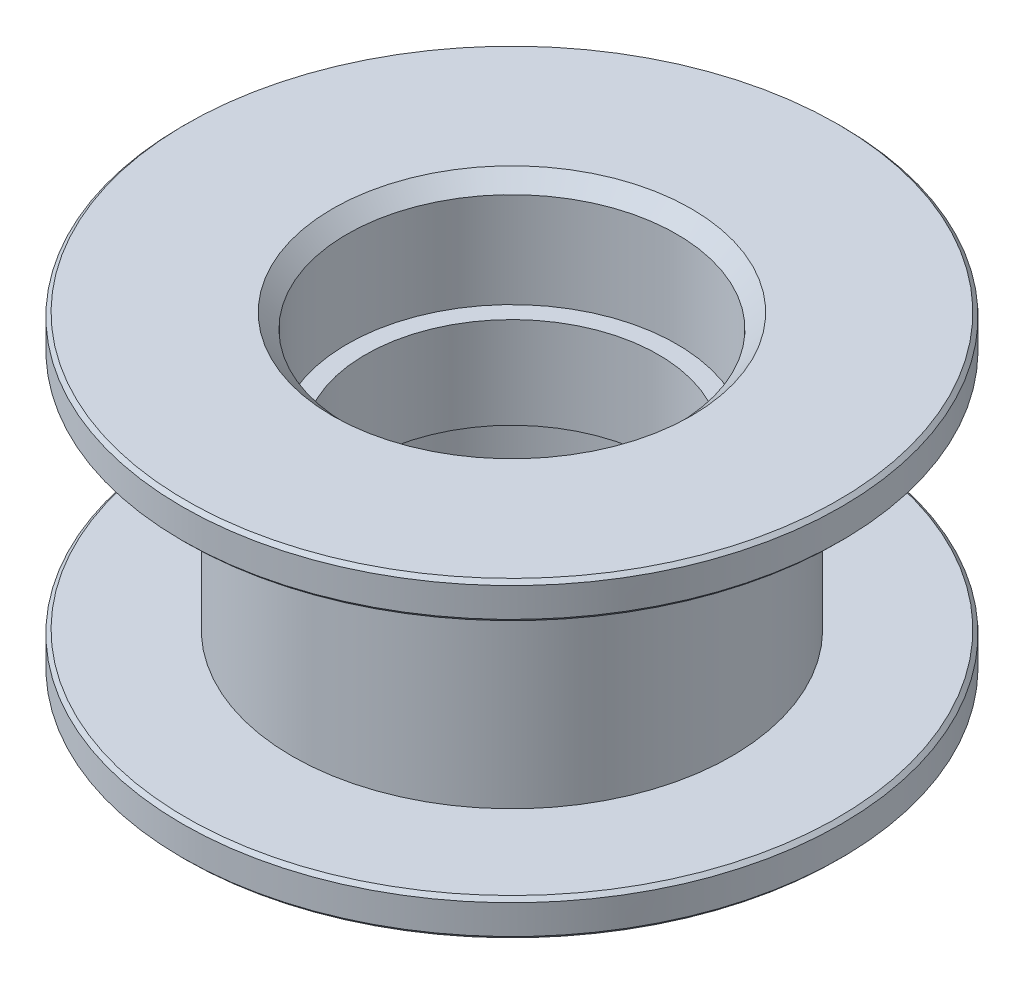
ISO-10303-21;
HEADER;
FILE_DESCRIPTION(('STEP AP214'),'2;1');
FILE_NAME('part.step','',(''),(''),'','','');
FILE_SCHEMA(('AUTOMOTIVE_DESIGN { 1 0 10303 214 1 1 1 1 }'));
ENDSEC;
DATA;
#1=APPLICATION_CONTEXT('core data for automotive mechanical design processes');
#2=APPLICATION_PROTOCOL_DEFINITION('international standard','automotive_design',2000,#1);
#3=PRODUCT_CONTEXT('',#1,'mechanical');
#4=PRODUCT('Part','Part','',(#3));
#5=PRODUCT_RELATED_PRODUCT_CATEGORY('part','',(#4));
#6=PRODUCT_DEFINITION_FORMATION('','',#4);
#7=PRODUCT_DEFINITION_CONTEXT('part definition',#1,'design');
#8=PRODUCT_DEFINITION('design','',#6,#7);
#9=PRODUCT_DEFINITION_SHAPE('','',#8);
#10=(LENGTH_UNIT() NAMED_UNIT(*) SI_UNIT(.MILLI.,.METRE.));
#11=(NAMED_UNIT(*) PLANE_ANGLE_UNIT() SI_UNIT($,.RADIAN.));
#12=(NAMED_UNIT(*) SI_UNIT($,.STERADIAN.) SOLID_ANGLE_UNIT());
#13=UNCERTAINTY_MEASURE_WITH_UNIT(LENGTH_MEASURE(1.E-05),#10,'distance_accuracy_value','');
#14=(GEOMETRIC_REPRESENTATION_CONTEXT(3) GLOBAL_UNCERTAINTY_ASSIGNED_CONTEXT((#13)) GLOBAL_UNIT_ASSIGNED_CONTEXT((#10,
#11,#12)) REPRESENTATION_CONTEXT('',''));
#15=CARTESIAN_POINT('',(0.,0.,0.));
#16=DIRECTION('',(0.,0.,1.));
#17=DIRECTION('',(1.,0.,0.));
#18=AXIS2_PLACEMENT_3D('',#15,#16,#17);
#19=CARTESIAN_POINT('',(6.,3.25,0.));
#20=DIRECTION('',(0.,1.,0.));
#21=DIRECTION('',(0.,0.,1.));
#22=AXIS2_PLACEMENT_3D('',#19,#20,#21);
#23=PLANE('',#22);
#24=CARTESIAN_POINT('',(0.,3.25,0.));
#25=DIRECTION('',(0.,1.,0.));
#26=DIRECTION('',(0.,0.,1.));
#27=AXIS2_PLACEMENT_3D('',#24,#25,#26);
#28=CIRCLE('',#27,8.9);
#29=CARTESIAN_POINT('',(0.,3.25,8.9));
#30=VERTEX_POINT('',#29);
#31=EDGE_CURVE('E41',#30,#30,#28,.F.);
#32=ORIENTED_EDGE('',*,*,#31,.T.);
#33=EDGE_LOOP('',(#32));
#34=FACE_BOUND('',#33,.T.);
#35=CARTESIAN_POINT('',(0.,3.25,0.));
#36=DIRECTION('',(0.,1.,0.));
#37=DIRECTION('',(0.,0.,1.));
#38=AXIS2_PLACEMENT_3D('',#35,#36,#37);
#39=CIRCLE('',#38,6.);
#40=CARTESIAN_POINT('',(0.,3.25,6.));
#41=VERTEX_POINT('',#40);
#42=EDGE_CURVE('E93',#41,#41,#39,.T.);
#43=ORIENTED_EDGE('',*,*,#42,.T.);
#44=EDGE_LOOP('',(#43));
#45=FACE_BOUND('',#44,.T.);
#46=ADVANCED_FACE('F34',(#34,#45),#23,.F.);
#47=CARTESIAN_POINT('',(0.,4.25,0.));
#48=DIRECTION('',(0.,1.,0.));
#49=DIRECTION('',(0.,0.,1.));
#50=AXIS2_PLACEMENT_3D('',#47,#48,#49);
#51=CYLINDRICAL_SURFACE('',#50,9.);
#52=CARTESIAN_POINT('',(0.,3.35,0.));
#53=DIRECTION('',(0.,1.,0.));
#54=DIRECTION('',(0.,0.,1.));
#55=AXIS2_PLACEMENT_3D('',#52,#53,#54);
#56=CIRCLE('',#55,9.);
#57=CARTESIAN_POINT('',(0.,3.35,9.));
#58=VERTEX_POINT('',#57);
#59=EDGE_CURVE('E45',#58,#58,#56,.T.);
#60=ORIENTED_EDGE('',*,*,#59,.T.);
#61=EDGE_LOOP('',(#60));
#62=FACE_BOUND('',#61,.T.);
#63=CARTESIAN_POINT('',(0.,4.15,0.));
#64=DIRECTION('',(0.,-1.,0.));
#65=DIRECTION('',(0.,0.,-1.));
#66=AXIS2_PLACEMENT_3D('',#63,#64,#65);
#67=CIRCLE('',#66,9.);
#68=CARTESIAN_POINT('',(0.,4.15,-9.));
#69=VERTEX_POINT('',#68);
#70=EDGE_CURVE('E49',#69,#69,#67,.T.);
#71=ORIENTED_EDGE('',*,*,#70,.T.);
#72=EDGE_LOOP('',(#71));
#73=FACE_BOUND('',#72,.T.);
#74=ADVANCED_FACE('F117',(#62,#73),#51,.T.);
#75=CARTESIAN_POINT('',(9.,4.25,0.));
#76=DIRECTION('',(0.,-1.,0.));
#77=DIRECTION('',(0.,0.,-1.));
#78=AXIS2_PLACEMENT_3D('',#75,#76,#77);
#79=PLANE('',#78);
#80=CARTESIAN_POINT('',(0.,4.25,0.));
#81=DIRECTION('',(0.,-1.,0.));
#82=DIRECTION('',(0.,0.,-1.));
#83=AXIS2_PLACEMENT_3D('',#80,#81,#82);
#84=CIRCLE('',#83,8.9);
#85=CARTESIAN_POINT('',(0.,4.25,-8.9));
#86=VERTEX_POINT('',#85);
#87=EDGE_CURVE('E10',#86,#86,#84,.F.);
#88=ORIENTED_EDGE('',*,*,#87,.T.);
#89=EDGE_LOOP('',(#88));
#90=FACE_BOUND('',#89,.T.);
#91=CARTESIAN_POINT('',(0.,4.25,0.));
#92=DIRECTION('',(0.,-1.,0.));
#93=DIRECTION('',(0.,0.,-1.));
#94=AXIS2_PLACEMENT_3D('',#91,#92,#93);
#95=CIRCLE('',#94,4.9);
#96=CARTESIAN_POINT('',(0.,4.25,4.9));
#97=VERTEX_POINT('',#96);
#98=EDGE_CURVE('E66',#97,#97,#95,.T.);
#99=ORIENTED_EDGE('',*,*,#98,.T.);
#100=EDGE_LOOP('',(#99));
#101=FACE_BOUND('',#100,.T.);
#102=ADVANCED_FACE('F122',(#90,#101),#79,.F.);
#103=CARTESIAN_POINT('',(0.,4.25,0.));
#104=DIRECTION('',(0.,1.,0.));
#105=DIRECTION('',(0.,0.,1.));
#106=AXIS2_PLACEMENT_3D('',#103,#104,#105);
#107=CYLINDRICAL_SURFACE('',#106,4.5);
#108=CARTESIAN_POINT('',(0.,3.85,0.));
#109=DIRECTION('',(0.,-1.,0.));
#110=DIRECTION('',(0.,0.,-1.));
#111=AXIS2_PLACEMENT_3D('',#108,#109,#110);
#112=CIRCLE('',#111,4.5);
#113=CARTESIAN_POINT('',(0.,3.85,4.5));
#114=VERTEX_POINT('',#113);
#115=EDGE_CURVE('E69',#114,#114,#112,.F.);
#116=ORIENTED_EDGE('',*,*,#115,.T.);
#117=EDGE_LOOP('',(#116));
#118=FACE_BOUND('',#117,.T.);
#119=CARTESIAN_POINT('',(0.,1.25,0.));
#120=DIRECTION('',(0.,1.,0.));
#121=DIRECTION('',(0.,0.,1.));
#122=AXIS2_PLACEMENT_3D('',#119,#120,#121);
#123=CIRCLE('',#122,4.5);
#124=CARTESIAN_POINT('',(0.,1.25,4.5));
#125=VERTEX_POINT('',#124);
#126=EDGE_CURVE('E78',#125,#125,#123,.T.);
#127=ORIENTED_EDGE('',*,*,#126,.F.);
#128=EDGE_LOOP('',(#127));
#129=FACE_BOUND('',#128,.T.);
#130=ADVANCED_FACE('F204',(#118,#129),#107,.F.);
#131=CARTESIAN_POINT('',(4.5,1.25,0.));
#132=DIRECTION('',(0.,-1.,0.));
#133=DIRECTION('',(0.,0.,-1.));
#134=AXIS2_PLACEMENT_3D('',#131,#132,#133);
#135=PLANE('',#134);
#136=CARTESIAN_POINT('',(0.,1.25,0.));
#137=DIRECTION('',(0.,1.,0.));
#138=DIRECTION('',(0.,0.,1.));
#139=AXIS2_PLACEMENT_3D('',#136,#137,#138);
#140=CIRCLE('',#139,4.);
#141=CARTESIAN_POINT('',(0.,1.25,4.));
#142=VERTEX_POINT('',#141);
#143=EDGE_CURVE('E81',#142,#142,#140,.T.);
#144=ORIENTED_EDGE('',*,*,#143,.F.);
#145=EDGE_LOOP('',(#144));
#146=FACE_BOUND('',#145,.T.);
#147=ORIENTED_EDGE('',*,*,#126,.T.);
#148=EDGE_LOOP('',(#147));
#149=FACE_BOUND('',#148,.T.);
#150=ADVANCED_FACE('F243',(#146,#149),#135,.F.);
#151=CARTESIAN_POINT('',(0.,4.25,0.));
#152=DIRECTION('',(0.,1.,0.));
#153=DIRECTION('',(0.,0.,1.));
#154=AXIS2_PLACEMENT_3D('',#151,#152,#153);
#155=CYLINDRICAL_SURFACE('',#154,4.);
#156=CARTESIAN_POINT('',(0.,-1.25,0.));
#157=DIRECTION('',(0.,1.,0.));
#158=DIRECTION('',(0.,0.,1.));
#159=AXIS2_PLACEMENT_3D('',#156,#157,#158);
#160=CIRCLE('',#159,4.);
#161=CARTESIAN_POINT('',(0.,-1.25,4.));
#162=VERTEX_POINT('',#161);
#163=EDGE_CURVE('E84',#162,#162,#160,.T.);
#164=ORIENTED_EDGE('',*,*,#163,.F.);
#165=EDGE_LOOP('',(#164));
#166=FACE_BOUND('',#165,.T.);
#167=ORIENTED_EDGE('',*,*,#143,.T.);
#168=EDGE_LOOP('',(#167));
#169=FACE_BOUND('',#168,.T.);
#170=ADVANCED_FACE('F258',(#166,#169),#155,.F.);
#171=CARTESIAN_POINT('',(4.,-1.25,0.));
#172=DIRECTION('',(0.,1.,0.));
#173=DIRECTION('',(0.,0.,1.));
#174=AXIS2_PLACEMENT_3D('',#171,#172,#173);
#175=PLANE('',#174);
#176=CARTESIAN_POINT('',(0.,-1.25,0.));
#177=DIRECTION('',(0.,1.,0.));
#178=DIRECTION('',(0.,0.,1.));
#179=AXIS2_PLACEMENT_3D('',#176,#177,#178);
#180=CIRCLE('',#179,4.5);
#181=CARTESIAN_POINT('',(0.,-1.25,4.5));
#182=VERTEX_POINT('',#181);
#183=EDGE_CURVE('E87',#182,#182,#180,.T.);
#184=ORIENTED_EDGE('',*,*,#183,.F.);
#185=EDGE_LOOP('',(#184));
#186=FACE_BOUND('',#185,.T.);
#187=ORIENTED_EDGE('',*,*,#163,.T.);
#188=EDGE_LOOP('',(#187));
#189=FACE_BOUND('',#188,.T.);
#190=ADVANCED_FACE('F233',(#186,#189),#175,.F.);
#191=CARTESIAN_POINT('',(0.,4.25,0.));
#192=DIRECTION('',(0.,1.,0.));
#193=DIRECTION('',(0.,0.,1.));
#194=AXIS2_PLACEMENT_3D('',#191,#192,#193);
#195=CYLINDRICAL_SURFACE('',#194,4.5);
#196=CARTESIAN_POINT('',(0.,-3.84999999999999,0.));
#197=DIRECTION('',(0.,1.,0.));
#198=DIRECTION('',(0.,0.,1.));
#199=AXIS2_PLACEMENT_3D('',#196,#197,#198);
#200=CIRCLE('',#199,4.5);
#201=CARTESIAN_POINT('',(0.,-3.84999999999999,4.5));
#202=VERTEX_POINT('',#201);
#203=EDGE_CURVE('E72',#202,#202,#200,.F.);
#204=ORIENTED_EDGE('',*,*,#203,.T.);
#205=EDGE_LOOP('',(#204));
#206=FACE_BOUND('',#205,.T.);
#207=ORIENTED_EDGE('',*,*,#183,.T.);
#208=EDGE_LOOP('',(#207));
#209=FACE_BOUND('',#208,.T.);
#210=ADVANCED_FACE('F192',(#206,#209),#195,.F.);
#211=CARTESIAN_POINT('',(4.5,-4.25,0.));
#212=DIRECTION('',(0.,1.,0.));
#213=DIRECTION('',(0.,0.,1.));
#214=AXIS2_PLACEMENT_3D('',#211,#212,#213);
#215=PLANE('',#214);
#216=CARTESIAN_POINT('',(0.,-4.25,0.));
#217=DIRECTION('',(0.,1.,0.));
#218=DIRECTION('',(0.,0.,1.));
#219=AXIS2_PLACEMENT_3D('',#216,#217,#218);
#220=CIRCLE('',#219,8.9);
#221=CARTESIAN_POINT('',(0.,-4.25,8.9));
#222=VERTEX_POINT('',#221);
#223=EDGE_CURVE('E57',#222,#222,#220,.F.);
#224=ORIENTED_EDGE('',*,*,#223,.T.);
#225=EDGE_LOOP('',(#224));
#226=FACE_BOUND('',#225,.T.);
#227=CARTESIAN_POINT('',(0.,-4.25,0.));
#228=DIRECTION('',(0.,1.,0.));
#229=DIRECTION('',(0.,0.,1.));
#230=AXIS2_PLACEMENT_3D('',#227,#228,#229);
#231=CIRCLE('',#230,4.9);
#232=CARTESIAN_POINT('',(0.,-4.25,4.9));
#233=VERTEX_POINT('',#232);
#234=EDGE_CURVE('E75',#233,#233,#231,.T.);
#235=ORIENTED_EDGE('',*,*,#234,.T.);
#236=EDGE_LOOP('',(#235));
#237=FACE_BOUND('',#236,.T.);
#238=ADVANCED_FACE('F113',(#226,#237),#215,.F.);
#239=CARTESIAN_POINT('',(0.,4.25,0.));
#240=DIRECTION('',(0.,1.,0.));
#241=DIRECTION('',(0.,0.,1.));
#242=AXIS2_PLACEMENT_3D('',#239,#240,#241);
#243=CYLINDRICAL_SURFACE('',#242,9.);
#244=CARTESIAN_POINT('',(0.,-4.15,0.));
#245=DIRECTION('',(0.,1.,0.));
#246=DIRECTION('',(0.,0.,1.));
#247=AXIS2_PLACEMENT_3D('',#244,#245,#246);
#248=CIRCLE('',#247,9.);
#249=CARTESIAN_POINT('',(0.,-4.15,9.));
#250=VERTEX_POINT('',#249);
#251=EDGE_CURVE('E60',#250,#250,#248,.T.);
#252=ORIENTED_EDGE('',*,*,#251,.T.);
#253=EDGE_LOOP('',(#252));
#254=FACE_BOUND('',#253,.T.);
#255=CARTESIAN_POINT('',(0.,-3.35,0.));
#256=DIRECTION('',(0.,-1.,0.));
#257=DIRECTION('',(0.,0.,-1.));
#258=AXIS2_PLACEMENT_3D('',#255,#256,#257);
#259=CIRCLE('',#258,9.);
#260=CARTESIAN_POINT('',(0.,-3.35,-9.));
#261=VERTEX_POINT('',#260);
#262=EDGE_CURVE('E63',#261,#261,#259,.T.);
#263=ORIENTED_EDGE('',*,*,#262,.T.);
#264=EDGE_LOOP('',(#263));
#265=FACE_BOUND('',#264,.T.);
#266=ADVANCED_FACE('F107',(#254,#265),#243,.T.);
#267=CARTESIAN_POINT('',(9.,-3.25,0.));
#268=DIRECTION('',(0.,-1.,0.));
#269=DIRECTION('',(0.,0.,-1.));
#270=AXIS2_PLACEMENT_3D('',#267,#268,#269);
#271=PLANE('',#270);
#272=CARTESIAN_POINT('',(0.,-3.25,0.));
#273=DIRECTION('',(0.,-1.,0.));
#274=DIRECTION('',(0.,0.,-1.));
#275=AXIS2_PLACEMENT_3D('',#272,#273,#274);
#276=CIRCLE('',#275,8.9);
#277=CARTESIAN_POINT('',(0.,-3.25,-8.9));
#278=VERTEX_POINT('',#277);
#279=EDGE_CURVE('E54',#278,#278,#276,.F.);
#280=ORIENTED_EDGE('',*,*,#279,.T.);
#281=EDGE_LOOP('',(#280));
#282=FACE_BOUND('',#281,.T.);
#283=CARTESIAN_POINT('',(0.,-3.25,0.));
#284=DIRECTION('',(0.,1.,0.));
#285=DIRECTION('',(0.,0.,1.));
#286=AXIS2_PLACEMENT_3D('',#283,#284,#285);
#287=CIRCLE('',#286,6.);
#288=CARTESIAN_POINT('',(0.,-3.25,6.));
#289=VERTEX_POINT('',#288);
#290=EDGE_CURVE('E90',#289,#289,#287,.T.);
#291=ORIENTED_EDGE('',*,*,#290,.F.);
#292=EDGE_LOOP('',(#291));
#293=FACE_BOUND('',#292,.T.);
#294=ADVANCED_FACE('F102',(#282,#293),#271,.F.);
#295=CARTESIAN_POINT('',(0.,4.25,0.));
#296=DIRECTION('',(0.,1.,0.));
#297=DIRECTION('',(0.,0.,1.));
#298=AXIS2_PLACEMENT_3D('',#295,#296,#297);
#299=CYLINDRICAL_SURFACE('',#298,6.);
#300=ORIENTED_EDGE('',*,*,#42,.F.);
#301=EDGE_LOOP('',(#300));
#302=FACE_BOUND('',#301,.T.);
#303=ORIENTED_EDGE('',*,*,#290,.T.);
#304=EDGE_LOOP('',(#303));
#305=FACE_BOUND('',#304,.T.);
#306=ADVANCED_FACE('F98',(#302,#305),#299,.T.);
#307=CARTESIAN_POINT('',(0.,-4.25,0.));
#308=DIRECTION('',(0.,-1.,0.));
#309=DIRECTION('',(0.,0.,-1.));
#310=AXIS2_PLACEMENT_3D('',#307,#308,#309);
#311=CONICAL_SURFACE('',#310,4.9,0.785398163397444);
#312=ORIENTED_EDGE('',*,*,#203,.F.);
#313=EDGE_LOOP('',(#312));
#314=FACE_BOUND('',#313,.T.);
#315=ORIENTED_EDGE('',*,*,#234,.F.);
#316=EDGE_LOOP('',(#315));
#317=FACE_BOUND('',#316,.T.);
#318=ADVANCED_FACE('F101',(#314,#317),#311,.F.);
#319=CARTESIAN_POINT('',(0.,3.85,0.));
#320=DIRECTION('',(0.,1.,0.));
#321=DIRECTION('',(0.,0.,1.));
#322=AXIS2_PLACEMENT_3D('',#319,#320,#321);
#323=CONICAL_SURFACE('',#322,4.5,0.785398163397453);
#324=CARTESIAN_POINT('',(0.,4.25,4.9));
#325=CARTESIAN_POINT('',(0.,4.24583333333333,4.89583333333334));
#326=CARTESIAN_POINT('',(0.,4.24166666666667,4.89166666666667));
#327=CARTESIAN_POINT('',(0.,4.23333333333333,4.88333333333333));
#328=CARTESIAN_POINT('',(0.,4.22916666666667,4.87916666666667));
#329=CARTESIAN_POINT('',(0.,4.22083333333333,4.87083333333334));
#330=CARTESIAN_POINT('',(0.,4.21666666666667,4.86666666666667));
#331=CARTESIAN_POINT('',(0.,4.20833333333333,4.85833333333334));
#332=CARTESIAN_POINT('',(0.,4.20416666666667,4.85416666666667));
#333=CARTESIAN_POINT('',(0.,4.19583333333333,4.84583333333333));
#334=CARTESIAN_POINT('',(0.,4.19166666666667,4.84166666666667));
#335=CARTESIAN_POINT('',(0.,4.18333333333333,4.83333333333333));
#336=CARTESIAN_POINT('',(0.,4.17916666666667,4.82916666666667));
#337=CARTESIAN_POINT('',(0.,4.17083333333333,4.82083333333333));
#338=CARTESIAN_POINT('',(0.,4.16666666666667,4.81666666666667));
#339=CARTESIAN_POINT('',(0.,4.15833333333333,4.80833333333333));
#340=CARTESIAN_POINT('',(0.,4.15416666666667,4.80416666666667));
#341=CARTESIAN_POINT('',(0.,4.14583333333333,4.79583333333333));
#342=CARTESIAN_POINT('',(0.,4.14166666666667,4.79166666666667));
#343=CARTESIAN_POINT('',(0.,4.13333333333333,4.78333333333333));
#344=CARTESIAN_POINT('',(0.,4.12916666666667,4.77916666666667));
#345=CARTESIAN_POINT('',(0.,4.12083333333333,4.77083333333333));
#346=CARTESIAN_POINT('',(0.,4.11666666666667,4.76666666666667));
#347=CARTESIAN_POINT('',(0.,4.10833333333333,4.75833333333333));
#348=CARTESIAN_POINT('',(0.,4.10416666666667,4.75416666666667));
#349=CARTESIAN_POINT('',(0.,4.09583333333333,4.74583333333333));
#350=CARTESIAN_POINT('',(0.,4.09166666666667,4.74166666666667));
#351=CARTESIAN_POINT('',(0.,4.08333333333333,4.73333333333334));
#352=CARTESIAN_POINT('',(0.,4.07916666666667,4.72916666666667));
#353=CARTESIAN_POINT('',(0.,4.07083333333334,4.72083333333333));
#354=CARTESIAN_POINT('',(0.,4.06666666666667,4.71666666666667));
#355=CARTESIAN_POINT('',(0.,4.05833333333333,4.70833333333333));
#356=CARTESIAN_POINT('',(0.,4.05416666666667,4.70416666666667));
#357=CARTESIAN_POINT('',(0.,4.04583333333333,4.69583333333333));
#358=CARTESIAN_POINT('',(0.,4.04166666666667,4.69166666666667));
#359=CARTESIAN_POINT('',(0.,4.03333333333333,4.68333333333333));
#360=CARTESIAN_POINT('',(0.,4.02916666666667,4.67916666666667));
#361=CARTESIAN_POINT('',(0.,4.02083333333333,4.67083333333333));
#362=CARTESIAN_POINT('',(0.,4.01666666666667,4.66666666666667));
#363=CARTESIAN_POINT('',(0.,4.00833333333333,4.65833333333333));
#364=CARTESIAN_POINT('',(0.,4.00416666666667,4.65416666666667));
#365=CARTESIAN_POINT('',(0.,3.99583333333333,4.64583333333333));
#366=CARTESIAN_POINT('',(0.,3.99166666666667,4.64166666666667));
#367=CARTESIAN_POINT('',(0.,3.98333333333334,4.63333333333333));
#368=CARTESIAN_POINT('',(0.,3.97916666666667,4.62916666666667));
#369=CARTESIAN_POINT('',(0.,3.97083333333333,4.62083333333333));
#370=CARTESIAN_POINT('',(0.,3.96666666666667,4.61666666666667));
#371=CARTESIAN_POINT('',(0.,3.95833333333333,4.60833333333333));
#372=CARTESIAN_POINT('',(0.,3.95416666666667,4.60416666666667));
#373=CARTESIAN_POINT('',(0.,3.94583333333333,4.59583333333333));
#374=CARTESIAN_POINT('',(0.,3.94166666666667,4.59166666666667));
#375=CARTESIAN_POINT('',(0.,3.93333333333333,4.58333333333333));
#376=CARTESIAN_POINT('',(0.,3.92916666666667,4.57916666666667));
#377=CARTESIAN_POINT('',(0.,3.92083333333334,4.57083333333333));
#378=CARTESIAN_POINT('',(0.,3.91666666666667,4.56666666666667));
#379=CARTESIAN_POINT('',(0.,3.90833333333333,4.55833333333333));
#380=CARTESIAN_POINT('',(0.,3.90416666666667,4.55416666666667));
#381=CARTESIAN_POINT('',(0.,3.89583333333333,4.54583333333333));
#382=CARTESIAN_POINT('',(0.,3.89166666666667,4.54166666666667));
#383=CARTESIAN_POINT('',(0.,3.88333333333333,4.53333333333333));
#384=CARTESIAN_POINT('',(0.,3.87916666666667,4.52916666666667));
#385=CARTESIAN_POINT('',(0.,3.87083333333333,4.52083333333333));
#386=CARTESIAN_POINT('',(0.,3.86666666666667,4.51666666666667));
#387=CARTESIAN_POINT('',(0.,3.85833333333333,4.50833333333333));
#388=CARTESIAN_POINT('',(0.,3.85416666666667,4.50416666666666));
#389=CARTESIAN_POINT('',(0.,3.85,4.5));
#390=B_SPLINE_CURVE_WITH_KNOTS('',3,(#324,#325,#326,#327,#328,#329,#330,#331,#332,#333,#334,
#335,#336,#337,#338,#339,#340,#341,#342,#343,#344,#345,#346,#347,#348,#349,#350,#351,#352,#353,
#354,#355,#356,#357,#358,#359,#360,#361,#362,#363,#364,#365,#366,#367,#368,#369,#370,#371,#372,
#373,#374,#375,#376,#377,#378,#379,#380,#381,#382,#383,#384,#385,#386,#387,#388,#389),
.UNSPECIFIED.,.F.,.F.,(4,2,2,2,2,2,2,2,2,2,2,2,2,2,2,2,2,2,2,2,2,2,2,2,2,2,2,2,2,2,2,2,4),(0.,
0.0176776695296642,0.0353553390593284,0.0530330085889914,0.0707106781186556,0.0883883476483191,
0.106066017177983,0.123743686707646,0.141421356237311,0.159099025766975,0.176776695296638,
0.194454364826302,0.212132034355965,0.229809703885629,0.247487373415293,0.265165042944957,
0.28284271247462,0.300520382004284,0.318198051533948,0.335875721063612,0.353553390593275,
0.371231060122939,0.388908729652603,0.406586399182267,0.42426406871193,0.441941738241595,
0.459619407771258,0.477297077300922,0.494974746830586,0.51265241636025,0.530330085889913,
0.548007755419577,0.565685424949241),.UNSPECIFIED.);
#391=EDGE_CURVE('BSEAM129',#97,#114,#390,.T.);
#392=ORIENTED_EDGE('',*,*,#98,.F.);
#393=ORIENTED_EDGE('',*,*,#115,.F.);
#394=ORIENTED_EDGE('',*,*,#391,.T.);
#395=ORIENTED_EDGE('',*,*,#391,.F.);
#396=EDGE_LOOP('',(#392,#394,#393,#395));
#397=FACE_BOUND('',#396,.T.);
#398=ADVANCED_FACE('F129',(#397),#323,.F.);
#399=CARTESIAN_POINT('',(0.,-4.15,0.));
#400=DIRECTION('',(0.,1.,0.));
#401=DIRECTION('',(0.,0.,1.));
#402=AXIS2_PLACEMENT_3D('',#399,#400,#401);
#403=CONICAL_SURFACE('',#402,9.,0.785398163397448);
#404=ORIENTED_EDGE('',*,*,#223,.F.);
#405=EDGE_LOOP('',(#404));
#406=FACE_BOUND('',#405,.T.);
#407=ORIENTED_EDGE('',*,*,#251,.F.);
#408=EDGE_LOOP('',(#407));
#409=FACE_BOUND('',#408,.T.);
#410=ADVANCED_FACE('F133',(#406,#409),#403,.T.);
#411=CARTESIAN_POINT('',(0.,-3.25,0.));
#412=DIRECTION('',(0.,-1.,0.));
#413=DIRECTION('',(0.,0.,-1.));
#414=AXIS2_PLACEMENT_3D('',#411,#412,#413);
#415=CONICAL_SURFACE('',#414,8.9,0.785398163397448);
#416=ORIENTED_EDGE('',*,*,#262,.F.);
#417=EDGE_LOOP('',(#416));
#418=FACE_BOUND('',#417,.T.);
#419=ORIENTED_EDGE('',*,*,#279,.F.);
#420=EDGE_LOOP('',(#419));
#421=FACE_BOUND('',#420,.T.);
#422=ADVANCED_FACE('F137',(#418,#421),#415,.T.);
#423=CARTESIAN_POINT('',(0.,3.35,0.));
#424=DIRECTION('',(0.,1.,0.));
#425=DIRECTION('',(0.,0.,1.));
#426=AXIS2_PLACEMENT_3D('',#423,#424,#425);
#427=CONICAL_SURFACE('',#426,9.,0.785398163397457);
#428=ORIENTED_EDGE('',*,*,#31,.F.);
#429=EDGE_LOOP('',(#428));
#430=FACE_BOUND('',#429,.T.);
#431=ORIENTED_EDGE('',*,*,#59,.F.);
#432=EDGE_LOOP('',(#431));
#433=FACE_BOUND('',#432,.T.);
#434=ADVANCED_FACE('F140',(#430,#433),#427,.T.);
#435=CARTESIAN_POINT('',(0.,4.25,0.));
#436=DIRECTION('',(0.,-1.,0.));
#437=DIRECTION('',(0.,0.,-1.));
#438=AXIS2_PLACEMENT_3D('',#435,#436,#437);
#439=CONICAL_SURFACE('',#438,8.9,0.785398163397448);
#440=ORIENTED_EDGE('',*,*,#70,.F.);
#441=EDGE_LOOP('',(#440));
#442=FACE_BOUND('',#441,.T.);
#443=ORIENTED_EDGE('',*,*,#87,.F.);
#444=EDGE_LOOP('',(#443));
#445=FACE_BOUND('',#444,.T.);
#446=ADVANCED_FACE('F36',(#442,#445),#439,.T.);
#447=CLOSED_SHELL('',(#46,#74,#102,#130,#150,#170,#190,#210,#238,#266,#294,#306,#318,#398,#410,
#422,#434,#446));
#448=MANIFOLD_SOLID_BREP('B2',#447);
#449=ADVANCED_BREP_SHAPE_REPRESENTATION('',(#18,#448),#14);
#450=SHAPE_DEFINITION_REPRESENTATION(#9,#449);
ENDSEC;
END-ISO-10303-21;
